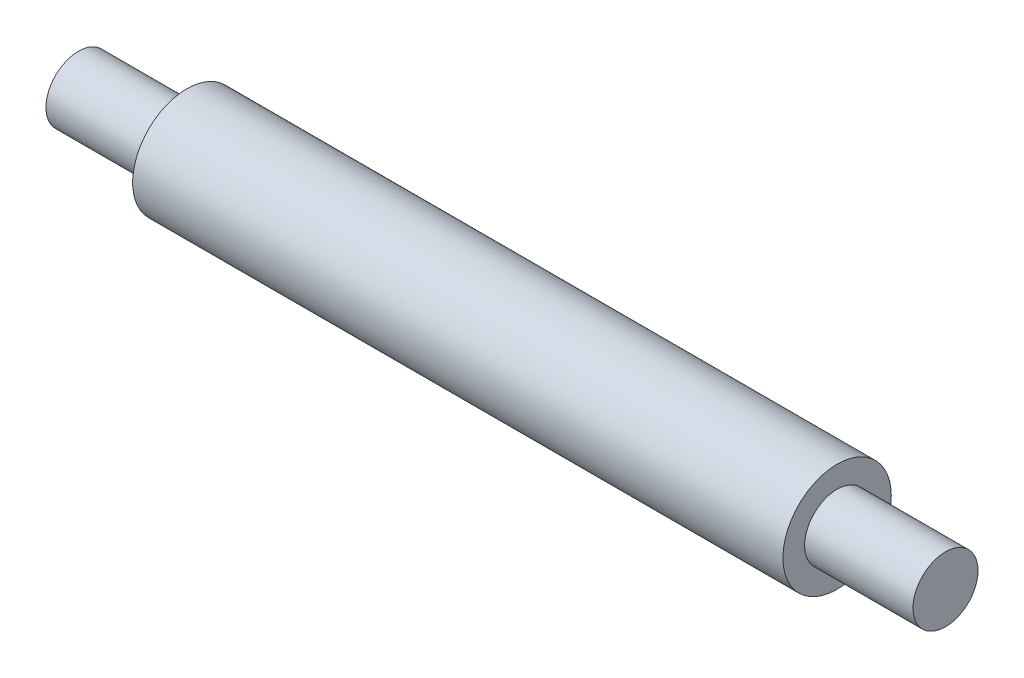
ISO-10303-21;
HEADER;
FILE_DESCRIPTION(('STEP AP214'),'2;1');
FILE_NAME('part.step','',(''),(''),'','','');
FILE_SCHEMA(('AUTOMOTIVE_DESIGN { 1 0 10303 214 1 1 1 1 }'));
ENDSEC;
DATA;
#1=APPLICATION_CONTEXT('core data for automotive mechanical design processes');
#2=APPLICATION_PROTOCOL_DEFINITION('international standard','automotive_design',2000,#1);
#3=PRODUCT_CONTEXT('',#1,'mechanical');
#4=PRODUCT('Part','Part','',(#3));
#5=PRODUCT_RELATED_PRODUCT_CATEGORY('part','',(#4));
#6=PRODUCT_DEFINITION_FORMATION('','',#4);
#7=PRODUCT_DEFINITION_CONTEXT('part definition',#1,'design');
#8=PRODUCT_DEFINITION('design','',#6,#7);
#9=PRODUCT_DEFINITION_SHAPE('','',#8);
#10=(LENGTH_UNIT() NAMED_UNIT(*) SI_UNIT(.MILLI.,.METRE.));
#11=(NAMED_UNIT(*) PLANE_ANGLE_UNIT() SI_UNIT($,.RADIAN.));
#12=(NAMED_UNIT(*) SI_UNIT($,.STERADIAN.) SOLID_ANGLE_UNIT());
#13=UNCERTAINTY_MEASURE_WITH_UNIT(LENGTH_MEASURE(1.E-05),#10,'distance_accuracy_value','');
#14=(GEOMETRIC_REPRESENTATION_CONTEXT(3) GLOBAL_UNCERTAINTY_ASSIGNED_CONTEXT((#13)) GLOBAL_UNIT_ASSIGNED_CONTEXT((#10,
#11,#12)) REPRESENTATION_CONTEXT('',''));
#15=CARTESIAN_POINT('',(0.,0.,0.));
#16=DIRECTION('',(0.,0.,1.));
#17=DIRECTION('',(1.,0.,0.));
#18=AXIS2_PLACEMENT_3D('',#15,#16,#17);
#19=CARTESIAN_POINT('',(30.,0.,0.));
#20=DIRECTION('',(1.,0.,0.));
#21=DIRECTION('',(0.,0.,-1.));
#22=AXIS2_PLACEMENT_3D('',#19,#20,#21);
#23=PLANE('',#22);
#24=CARTESIAN_POINT('',(30.,0.,0.));
#25=DIRECTION('',(1.,0.,0.));
#26=DIRECTION('',(0.,0.,-1.));
#27=AXIS2_PLACEMENT_3D('',#24,#25,#26);
#28=CIRCLE('',#27,5.);
#29=CARTESIAN_POINT('',(30.,0.,-5.));
#30=VERTEX_POINT('',#29);
#31=EDGE_CURVE('E36',#30,#30,#28,.T.);
#32=ORIENTED_EDGE('',*,*,#31,.T.);
#33=EDGE_LOOP('',(#32));
#34=FACE_BOUND('',#33,.T.);
#35=CARTESIAN_POINT('',(30.,0.,0.));
#36=DIRECTION('',(1.,0.,0.));
#37=DIRECTION('',(0.,0.,-1.));
#38=AXIS2_PLACEMENT_3D('',#35,#36,#37);
#39=CIRCLE('',#38,3.);
#40=CARTESIAN_POINT('',(30.,0.,-3.));
#41=VERTEX_POINT('',#40);
#42=EDGE_CURVE('E44',#41,#41,#39,.T.);
#43=ORIENTED_EDGE('',*,*,#42,.F.);
#44=EDGE_LOOP('',(#43));
#45=FACE_BOUND('',#44,.T.);
#46=ADVANCED_FACE('F29',(#34,#45),#23,.T.);
#47=CARTESIAN_POINT('',(-30.,0.,0.));
#48=DIRECTION('',(1.,0.,0.));
#49=DIRECTION('',(0.,0.,-1.));
#50=AXIS2_PLACEMENT_3D('',#47,#48,#49);
#51=CYLINDRICAL_SURFACE('',#50,5.);
#52=CARTESIAN_POINT('',(-30.,0.,0.));
#53=DIRECTION('',(1.,0.,0.));
#54=DIRECTION('',(0.,0.,-1.));
#55=AXIS2_PLACEMENT_3D('',#52,#53,#54);
#56=CIRCLE('',#55,5.);
#57=CARTESIAN_POINT('',(-30.,0.,-5.));
#58=VERTEX_POINT('',#57);
#59=EDGE_CURVE('E10',#58,#58,#56,.T.);
#60=ORIENTED_EDGE('',*,*,#59,.T.);
#61=EDGE_LOOP('',(#60));
#62=FACE_BOUND('',#61,.T.);
#63=ORIENTED_EDGE('',*,*,#31,.F.);
#64=EDGE_LOOP('',(#63));
#65=FACE_BOUND('',#64,.T.);
#66=ADVANCED_FACE('F31',(#62,#65),#51,.T.);
#67=CARTESIAN_POINT('',(-30.,0.,0.));
#68=DIRECTION('',(1.,0.,0.));
#69=DIRECTION('',(0.,0.,-1.));
#70=AXIS2_PLACEMENT_3D('',#67,#68,#69);
#71=PLANE('',#70);
#72=CARTESIAN_POINT('',(-30.,0.,0.));
#73=DIRECTION('',(1.,0.,0.));
#74=DIRECTION('',(0.,0.,-1.));
#75=AXIS2_PLACEMENT_3D('',#72,#73,#74);
#76=CIRCLE('',#75,3.);
#77=CARTESIAN_POINT('',(-30.,0.,-3.));
#78=VERTEX_POINT('',#77);
#79=EDGE_CURVE('E50',#78,#78,#76,.T.);
#80=ORIENTED_EDGE('',*,*,#79,.T.);
#81=EDGE_LOOP('',(#80));
#82=FACE_BOUND('',#81,.T.);
#83=ORIENTED_EDGE('',*,*,#59,.F.);
#84=EDGE_LOOP('',(#83));
#85=FACE_BOUND('',#84,.T.);
#86=ADVANCED_FACE('F72',(#82,#85),#71,.F.);
#87=CARTESIAN_POINT('',(40.,0.,0.));
#88=DIRECTION('',(-1.,0.,0.));
#89=DIRECTION('',(0.,0.,1.));
#90=AXIS2_PLACEMENT_3D('',#87,#88,#89);
#91=CYLINDRICAL_SURFACE('',#90,3.);
#92=CARTESIAN_POINT('',(40.,0.,0.));
#93=DIRECTION('',(1.,0.,0.));
#94=DIRECTION('',(0.,0.,-1.));
#95=AXIS2_PLACEMENT_3D('',#92,#93,#94);
#96=CIRCLE('',#95,3.);
#97=CARTESIAN_POINT('',(40.,0.,-3.));
#98=VERTEX_POINT('',#97);
#99=EDGE_CURVE('E40',#98,#98,#96,.T.);
#100=ORIENTED_EDGE('',*,*,#99,.F.);
#101=EDGE_LOOP('',(#100));
#102=FACE_BOUND('',#101,.T.);
#103=ORIENTED_EDGE('',*,*,#42,.T.);
#104=EDGE_LOOP('',(#103));
#105=FACE_BOUND('',#104,.T.);
#106=ADVANCED_FACE('F75',(#102,#105),#91,.T.);
#107=CARTESIAN_POINT('',(40.,0.,0.));
#108=DIRECTION('',(1.,0.,0.));
#109=DIRECTION('',(0.,0.,-1.));
#110=AXIS2_PLACEMENT_3D('',#107,#108,#109);
#111=PLANE('',#110);
#112=ORIENTED_EDGE('',*,*,#99,.T.);
#113=EDGE_LOOP('',(#112));
#114=FACE_BOUND('',#113,.T.);
#115=ADVANCED_FACE('F65',(#114),#111,.T.);
#116=CARTESIAN_POINT('',(-40.,0.,0.));
#117=DIRECTION('',(1.,0.,0.));
#118=DIRECTION('',(0.,0.,-1.));
#119=AXIS2_PLACEMENT_3D('',#116,#117,#118);
#120=CYLINDRICAL_SURFACE('',#119,3.);
#121=CARTESIAN_POINT('',(-40.,0.,0.));
#122=DIRECTION('',(1.,0.,0.));
#123=DIRECTION('',(0.,0.,-1.));
#124=AXIS2_PLACEMENT_3D('',#121,#122,#123);
#125=CIRCLE('',#124,3.);
#126=CARTESIAN_POINT('',(-40.,0.,-3.));
#127=VERTEX_POINT('',#126);
#128=EDGE_CURVE('E48',#127,#127,#125,.T.);
#129=ORIENTED_EDGE('',*,*,#128,.T.);
#130=EDGE_LOOP('',(#129));
#131=FACE_BOUND('',#130,.T.);
#132=ORIENTED_EDGE('',*,*,#79,.F.);
#133=EDGE_LOOP('',(#132));
#134=FACE_BOUND('',#133,.T.);
#135=ADVANCED_FACE('F56',(#131,#134),#120,.T.);
#136=CARTESIAN_POINT('',(-40.,0.,0.));
#137=DIRECTION('',(-1.,0.,0.));
#138=DIRECTION('',(0.,0.,-1.));
#139=AXIS2_PLACEMENT_3D('',#136,#137,#138);
#140=PLANE('',#139);
#141=ORIENTED_EDGE('',*,*,#128,.F.);
#142=EDGE_LOOP('',(#141));
#143=FACE_BOUND('',#142,.T.);
#144=ADVANCED_FACE('F59',(#143),#140,.T.);
#145=CLOSED_SHELL('',(#46,#66,#86,#106,#115,#135,#144));
#146=MANIFOLD_SOLID_BREP('B2',#145);
#147=ADVANCED_BREP_SHAPE_REPRESENTATION('',(#18,#146),#14);
#148=SHAPE_DEFINITION_REPRESENTATION(#9,#147);
ENDSEC;
END-ISO-10303-21;
